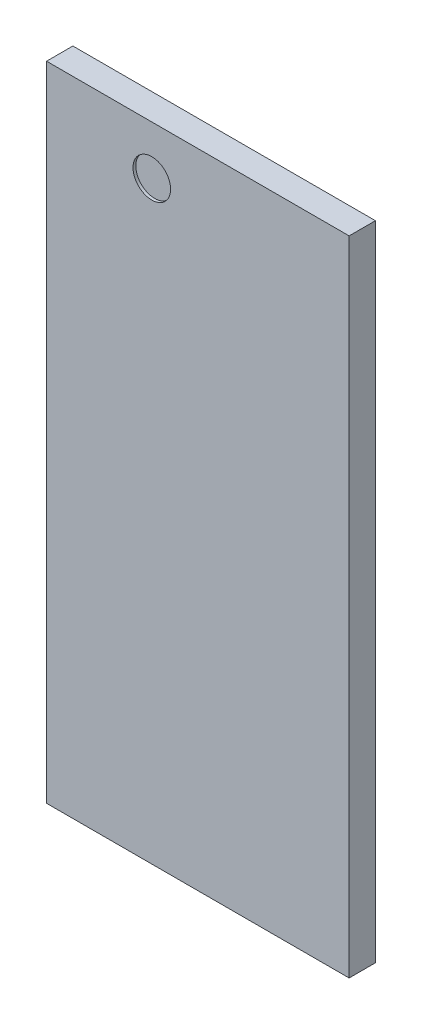
ISO-10303-21;
HEADER;
FILE_DESCRIPTION(('STEP AP214'),'2;1');
FILE_NAME('part.step','',(''),(''),'','','');
FILE_SCHEMA(('AUTOMOTIVE_DESIGN { 1 0 10303 214 1 1 1 1 }'));
ENDSEC;
DATA;
#1=APPLICATION_CONTEXT('core data for automotive mechanical design processes');
#2=APPLICATION_PROTOCOL_DEFINITION('international standard','automotive_design',2000,#1);
#3=PRODUCT_CONTEXT('',#1,'mechanical');
#4=PRODUCT('Part','Part','',(#3));
#5=PRODUCT_RELATED_PRODUCT_CATEGORY('part','',(#4));
#6=PRODUCT_DEFINITION_FORMATION('','',#4);
#7=PRODUCT_DEFINITION_CONTEXT('part definition',#1,'design');
#8=PRODUCT_DEFINITION('design','',#6,#7);
#9=PRODUCT_DEFINITION_SHAPE('','',#8);
#10=(LENGTH_UNIT() NAMED_UNIT(*) SI_UNIT(.MILLI.,.METRE.));
#11=(NAMED_UNIT(*) PLANE_ANGLE_UNIT() SI_UNIT($,.RADIAN.));
#12=(NAMED_UNIT(*) SI_UNIT($,.STERADIAN.) SOLID_ANGLE_UNIT());
#13=UNCERTAINTY_MEASURE_WITH_UNIT(LENGTH_MEASURE(1.E-05),#10,'distance_accuracy_value','');
#14=(GEOMETRIC_REPRESENTATION_CONTEXT(3) GLOBAL_UNCERTAINTY_ASSIGNED_CONTEXT((#13)) GLOBAL_UNIT_ASSIGNED_CONTEXT((#10,
#11,#12)) REPRESENTATION_CONTEXT('',''));
#15=CARTESIAN_POINT('',(0.,0.,0.));
#16=DIRECTION('',(0.,0.,1.));
#17=DIRECTION('',(1.,0.,0.));
#18=AXIS2_PLACEMENT_3D('',#15,#16,#17);
#19=CARTESIAN_POINT('',(-80.5,171.,-14.));
#20=DIRECTION('',(-1.,0.,0.));
#21=DIRECTION('',(0.,-1.,0.));
#22=AXIS2_PLACEMENT_3D('',#19,#20,#21);
#23=PLANE('',#22);
#24=DIRECTION('',(0.,-1.,0.));
#25=VECTOR('',#24,1.);
#26=CARTESIAN_POINT('',(-80.5,171.,0.));
#27=LINE('',#26,#25);
#28=CARTESIAN_POINT('',(-80.5,171.,0.));
#29=VERTEX_POINT('',#28);
#30=CARTESIAN_POINT('',(-80.5,-171.,0.));
#31=VERTEX_POINT('',#30);
#32=EDGE_CURVE('E103',#29,#31,#27,.T.);
#33=ORIENTED_EDGE('',*,*,#32,.F.);
#34=DIRECTION('',(0.,0.,1.));
#35=VECTOR('',#34,1.);
#36=CARTESIAN_POINT('',(-80.5,171.,-14.));
#37=LINE('',#36,#35);
#38=CARTESIAN_POINT('',(-80.5,171.,-14.));
#39=VERTEX_POINT('',#38);
#40=EDGE_CURVE('E11',#39,#29,#37,.T.);
#41=ORIENTED_EDGE('',*,*,#40,.F.);
#42=DIRECTION('',(0.,-1.,0.));
#43=VECTOR('',#42,1.);
#44=CARTESIAN_POINT('',(-80.5,171.,-14.));
#45=LINE('',#44,#43);
#46=CARTESIAN_POINT('',(-80.5,-171.,-14.));
#47=VERTEX_POINT('',#46);
#48=EDGE_CURVE('E97',#39,#47,#45,.T.);
#49=ORIENTED_EDGE('',*,*,#48,.T.);
#50=DIRECTION('',(0.,0.,1.));
#51=VECTOR('',#50,1.);
#52=CARTESIAN_POINT('',(-80.5,-171.,-14.));
#53=LINE('',#52,#51);
#54=EDGE_CURVE('E40',#47,#31,#53,.T.);
#55=ORIENTED_EDGE('',*,*,#54,.T.);
#56=EDGE_LOOP('',(#33,#41,#49,#55));
#57=FACE_BOUND('',#56,.T.);
#58=ADVANCED_FACE('F37',(#57),#23,.T.);
#59=CARTESIAN_POINT('',(-80.5,171.,-14.));
#60=DIRECTION('',(0.,-1.,0.));
#61=DIRECTION('',(0.,0.,-1.));
#62=AXIS2_PLACEMENT_3D('',#59,#60,#61);
#63=PLANE('',#62);
#64=DIRECTION('',(1.,0.,0.));
#65=VECTOR('',#64,1.);
#66=CARTESIAN_POINT('',(-80.5,171.,0.));
#67=LINE('',#66,#65);
#68=CARTESIAN_POINT('',(80.5,171.,0.));
#69=VERTEX_POINT('',#68);
#70=EDGE_CURVE('E70',#29,#69,#67,.T.);
#71=ORIENTED_EDGE('',*,*,#70,.T.);
#72=DIRECTION('',(0.,0.,1.));
#73=VECTOR('',#72,1.);
#74=CARTESIAN_POINT('',(80.5,171.,-14.));
#75=LINE('',#74,#73);
#76=CARTESIAN_POINT('',(80.5,171.,-14.));
#77=VERTEX_POINT('',#76);
#78=EDGE_CURVE('E46',#77,#69,#75,.T.);
#79=ORIENTED_EDGE('',*,*,#78,.F.);
#80=DIRECTION('',(1.,0.,0.));
#81=VECTOR('',#80,1.);
#82=CARTESIAN_POINT('',(-80.5,171.,-14.));
#83=LINE('',#82,#81);
#84=EDGE_CURVE('E87',#39,#77,#83,.T.);
#85=ORIENTED_EDGE('',*,*,#84,.F.);
#86=ORIENTED_EDGE('',*,*,#40,.T.);
#87=EDGE_LOOP('',(#71,#79,#85,#86));
#88=FACE_BOUND('',#87,.T.);
#89=ADVANCED_FACE('F114',(#88),#63,.F.);
#90=CARTESIAN_POINT('',(80.5,171.,-14.));
#91=DIRECTION('',(-1.,0.,0.));
#92=DIRECTION('',(0.,-1.,0.));
#93=AXIS2_PLACEMENT_3D('',#90,#91,#92);
#94=PLANE('',#93);
#95=DIRECTION('',(0.,-1.,0.));
#96=VECTOR('',#95,1.);
#97=CARTESIAN_POINT('',(80.5,171.,0.));
#98=LINE('',#97,#96);
#99=CARTESIAN_POINT('',(80.5,-171.,0.));
#100=VERTEX_POINT('',#99);
#101=EDGE_CURVE('E94',#69,#100,#98,.T.);
#102=ORIENTED_EDGE('',*,*,#101,.T.);
#103=DIRECTION('',(0.,0.,1.));
#104=VECTOR('',#103,1.);
#105=CARTESIAN_POINT('',(80.5,-171.,-14.));
#106=LINE('',#105,#104);
#107=CARTESIAN_POINT('',(80.5,-171.,-14.));
#108=VERTEX_POINT('',#107);
#109=EDGE_CURVE('E91',#108,#100,#106,.T.);
#110=ORIENTED_EDGE('',*,*,#109,.F.);
#111=DIRECTION('',(0.,-1.,0.));
#112=VECTOR('',#111,1.);
#113=CARTESIAN_POINT('',(80.5,171.,-14.));
#114=LINE('',#113,#112);
#115=EDGE_CURVE('E82',#77,#108,#114,.T.);
#116=ORIENTED_EDGE('',*,*,#115,.F.);
#117=ORIENTED_EDGE('',*,*,#78,.T.);
#118=EDGE_LOOP('',(#102,#110,#116,#117));
#119=FACE_BOUND('',#118,.T.);
#120=ADVANCED_FACE('F92',(#119),#94,.F.);
#121=CARTESIAN_POINT('',(-80.5,-171.,-14.));
#122=DIRECTION('',(0.,-1.,0.));
#123=DIRECTION('',(0.,0.,-1.));
#124=AXIS2_PLACEMENT_3D('',#121,#122,#123);
#125=PLANE('',#124);
#126=DIRECTION('',(1.,0.,0.));
#127=VECTOR('',#126,1.);
#128=CARTESIAN_POINT('',(-80.5,-171.,0.));
#129=LINE('',#128,#127);
#130=EDGE_CURVE('E106',#31,#100,#129,.T.);
#131=ORIENTED_EDGE('',*,*,#130,.F.);
#132=ORIENTED_EDGE('',*,*,#54,.F.);
#133=DIRECTION('',(1.,0.,0.));
#134=VECTOR('',#133,1.);
#135=CARTESIAN_POINT('',(-80.5,-171.,-14.));
#136=LINE('',#135,#134);
#137=EDGE_CURVE('E86',#47,#108,#136,.T.);
#138=ORIENTED_EDGE('',*,*,#137,.T.);
#139=ORIENTED_EDGE('',*,*,#109,.T.);
#140=EDGE_LOOP('',(#131,#132,#138,#139));
#141=FACE_BOUND('',#140,.T.);
#142=ADVANCED_FACE('F96',(#141),#125,.T.);
#143=CARTESIAN_POINT('',(0.,0.,-14.));
#144=DIRECTION('',(0.,0.,1.));
#145=DIRECTION('',(1.,0.,0.));
#146=AXIS2_PLACEMENT_3D('',#143,#144,#145);
#147=PLANE('',#146);
#148=ORIENTED_EDGE('',*,*,#48,.F.);
#149=ORIENTED_EDGE('',*,*,#84,.T.);
#150=ORIENTED_EDGE('',*,*,#115,.T.);
#151=ORIENTED_EDGE('',*,*,#137,.F.);
#152=EDGE_LOOP('',(#148,#149,#150,#151));
#153=FACE_BOUND('',#152,.T.);
#154=ADVANCED_FACE('F85',(#153),#147,.F.);
#155=CARTESIAN_POINT('',(0.,0.,0.));
#156=DIRECTION('',(0.,0.,1.));
#157=DIRECTION('',(1.,0.,0.));
#158=AXIS2_PLACEMENT_3D('',#155,#156,#157);
#159=PLANE('',#158);
#160=CARTESIAN_POINT('',(-24.5000000000001,145.,0.));
#161=DIRECTION('',(0.,0.,1.));
#162=DIRECTION('',(1.,0.,0.));
#163=AXIS2_PLACEMENT_3D('',#160,#161,#162);
#164=CIRCLE('',#163,10.);
#165=CARTESIAN_POINT('',(-14.5000000000001,145.,0.));
#166=VERTEX_POINT('',#165);
#167=EDGE_CURVE('E145',#166,#166,#164,.T.);
#168=ORIENTED_EDGE('',*,*,#167,.F.);
#169=EDGE_LOOP('',(#168));
#170=FACE_BOUND('',#169,.T.);
#171=ORIENTED_EDGE('',*,*,#32,.T.);
#172=ORIENTED_EDGE('',*,*,#130,.T.);
#173=ORIENTED_EDGE('',*,*,#101,.F.);
#174=ORIENTED_EDGE('',*,*,#70,.F.);
#175=EDGE_LOOP('',(#171,#172,#173,#174));
#176=FACE_BOUND('',#175,.T.);
#177=ADVANCED_FACE('F112',(#170,#176),#159,.T.);
#178=CARTESIAN_POINT('',(-24.5000000000001,145.,-1.5));
#179=DIRECTION('',(0.,0.,1.));
#180=DIRECTION('',(1.,0.,0.));
#181=AXIS2_PLACEMENT_3D('',#178,#179,#180);
#182=CYLINDRICAL_SURFACE('',#181,10.);
#183=CARTESIAN_POINT('',(-24.5000000000001,145.,-1.5));
#184=DIRECTION('',(0.,0.,1.));
#185=DIRECTION('',(1.,0.,0.));
#186=AXIS2_PLACEMENT_3D('',#183,#184,#185);
#187=CIRCLE('',#186,10.);
#188=CARTESIAN_POINT('',(-14.5000000000001,145.,-1.5));
#189=VERTEX_POINT('',#188);
#190=EDGE_CURVE('E107',#189,#189,#187,.T.);
#191=ORIENTED_EDGE('',*,*,#190,.F.);
#192=EDGE_LOOP('',(#191));
#193=FACE_BOUND('',#192,.T.);
#194=ORIENTED_EDGE('',*,*,#167,.T.);
#195=EDGE_LOOP('',(#194));
#196=FACE_BOUND('',#195,.T.);
#197=ADVANCED_FACE('F132',(#193,#196),#182,.F.);
#198=CARTESIAN_POINT('',(-24.5000000000001,145.,-1.5));
#199=DIRECTION('',(0.,0.,1.));
#200=DIRECTION('',(1.,0.,0.));
#201=AXIS2_PLACEMENT_3D('',#198,#199,#200);
#202=PLANE('',#201);
#203=ORIENTED_EDGE('',*,*,#190,.T.);
#204=EDGE_LOOP('',(#203));
#205=FACE_BOUND('',#204,.T.);
#206=ADVANCED_FACE('F137',(#205),#202,.T.);
#207=CLOSED_SHELL('',(#58,#89,#120,#142,#154,#177,#197,#206));
#208=MANIFOLD_SOLID_BREP('B2',#207);
#209=ADVANCED_BREP_SHAPE_REPRESENTATION('',(#18,#208),#14);
#210=SHAPE_DEFINITION_REPRESENTATION(#9,#209);
ENDSEC;
END-ISO-10303-21;
